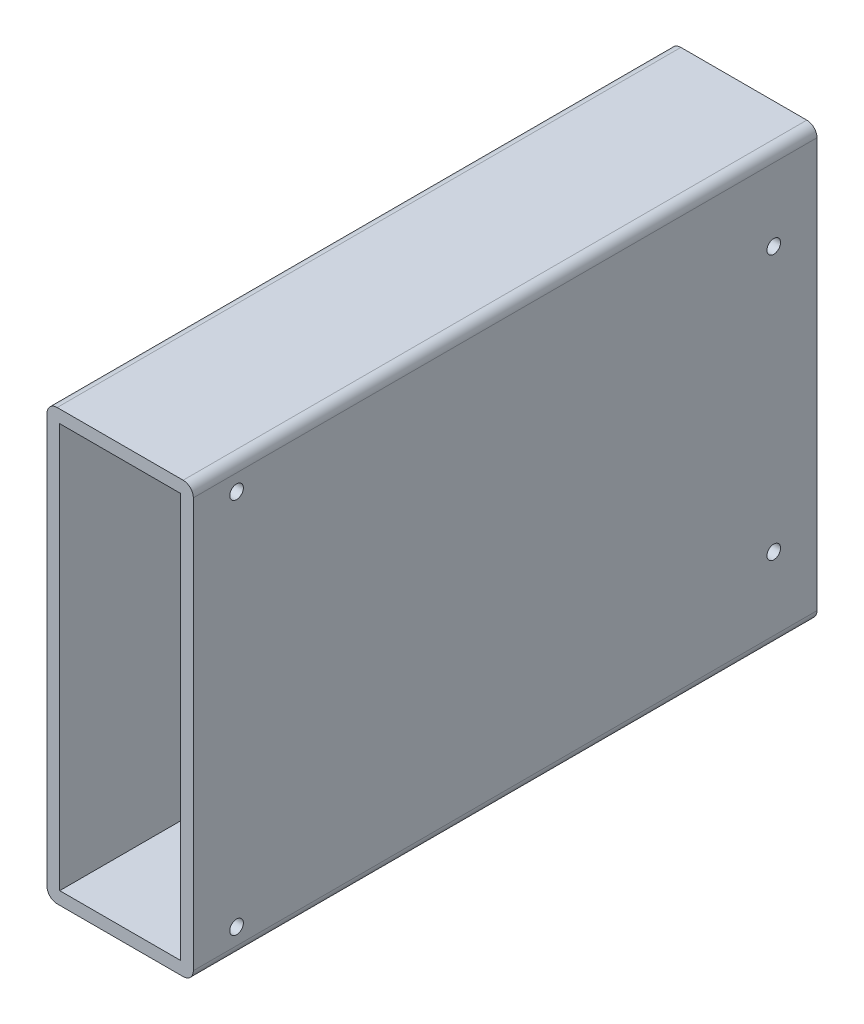
ISO-10303-21;
HEADER;
FILE_DESCRIPTION(('STEP AP214'),'2;1');
FILE_NAME('part.step','',(''),(''),'','','');
FILE_SCHEMA(('AUTOMOTIVE_DESIGN { 1 0 10303 214 1 1 1 1 }'));
ENDSEC;
DATA;
#1=APPLICATION_CONTEXT('core data for automotive mechanical design processes');
#2=APPLICATION_PROTOCOL_DEFINITION('international standard','automotive_design',2000,#1);
#3=PRODUCT_CONTEXT('',#1,'mechanical');
#4=PRODUCT('Part','Part','',(#3));
#5=PRODUCT_RELATED_PRODUCT_CATEGORY('part','',(#4));
#6=PRODUCT_DEFINITION_FORMATION('','',#4);
#7=PRODUCT_DEFINITION_CONTEXT('part definition',#1,'design');
#8=PRODUCT_DEFINITION('design','',#6,#7);
#9=PRODUCT_DEFINITION_SHAPE('','',#8);
#10=(LENGTH_UNIT() NAMED_UNIT(*) SI_UNIT(.MILLI.,.METRE.));
#11=(NAMED_UNIT(*) PLANE_ANGLE_UNIT() SI_UNIT($,.RADIAN.));
#12=(NAMED_UNIT(*) SI_UNIT($,.STERADIAN.) SOLID_ANGLE_UNIT());
#13=UNCERTAINTY_MEASURE_WITH_UNIT(LENGTH_MEASURE(1.E-05),#10,'distance_accuracy_value','');
#14=(GEOMETRIC_REPRESENTATION_CONTEXT(3) GLOBAL_UNCERTAINTY_ASSIGNED_CONTEXT((#13)) GLOBAL_UNIT_ASSIGNED_CONTEXT((#10,
#11,#12)) REPRESENTATION_CONTEXT('',''));
#15=CARTESIAN_POINT('',(0.,0.,0.));
#16=DIRECTION('',(0.,0.,1.));
#17=DIRECTION('',(1.,0.,0.));
#18=AXIS2_PLACEMENT_3D('',#15,#16,#17);
#19=CARTESIAN_POINT('',(36.5,0.,0.));
#20=DIRECTION('',(-1.,0.,0.));
#21=DIRECTION('',(0.,0.,1.));
#22=AXIS2_PLACEMENT_3D('',#19,#20,#21);
#23=PLANE('',#22);
#24=CARTESIAN_POINT('',(36.5,6.61875001399973,-10.7875000000006));
#25=DIRECTION('',(1.,0.,0.));
#26=DIRECTION('',(0.,0.,-1.));
#27=AXIS2_PLACEMENT_3D('',#24,#25,#26);
#28=CIRCLE('',#27,1.69999999999999);
#29=CARTESIAN_POINT('',(36.5,6.61875001399973,-12.4875000000006));
#30=VERTEX_POINT('',#29);
#31=EDGE_CURVE('E444',#30,#30,#28,.T.);
#32=ORIENTED_EDGE('',*,*,#31,.F.);
#33=EDGE_LOOP('',(#32));
#34=FACE_BOUND('',#33,.T.);
#35=CARTESIAN_POINT('',(36.5,100.618750014,-10.7875000000006));
#36=DIRECTION('',(1.,0.,0.));
#37=DIRECTION('',(0.,0.,-1.));
#38=AXIS2_PLACEMENT_3D('',#35,#36,#37);
#39=CIRCLE('',#38,1.69999999999999);
#40=CARTESIAN_POINT('',(36.5,100.618750014,-12.4875000000006));
#41=VERTEX_POINT('',#40);
#42=EDGE_CURVE('E450',#41,#41,#39,.T.);
#43=ORIENTED_EDGE('',*,*,#42,.F.);
#44=EDGE_LOOP('',(#43));
#45=FACE_BOUND('',#44,.T.);
#46=DIRECTION('',(0.,-1.,0.));
#47=VECTOR('',#46,1.);
#48=CARTESIAN_POINT('',(36.5,0.,0.));
#49=LINE('',#48,#47);
#50=CARTESIAN_POINT('',(36.5,104.697500028,0.));
#51=VERTEX_POINT('',#50);
#52=CARTESIAN_POINT('',(36.5,2.54,0.));
#53=VERTEX_POINT('',#52);
#54=EDGE_CURVE('E231',#51,#53,#49,.T.);
#55=ORIENTED_EDGE('',*,*,#54,.T.);
#56=DIRECTION('',(0.,0.,-1.));
#57=VECTOR('',#56,1.);
#58=CARTESIAN_POINT('',(36.5,2.54,0.));
#59=LINE('',#58,#57);
#60=CARTESIAN_POINT('',(36.5,2.54,-155.575));
#61=VERTEX_POINT('',#60);
#62=EDGE_CURVE('E257',#53,#61,#59,.T.);
#63=ORIENTED_EDGE('',*,*,#62,.T.);
#64=DIRECTION('',(0.,1.,0.));
#65=VECTOR('',#64,1.);
#66=CARTESIAN_POINT('',(36.5,0.,-155.575));
#67=LINE('',#66,#65);
#68=CARTESIAN_POINT('',(36.5,104.697500028,-155.575));
#69=VERTEX_POINT('',#68);
#70=EDGE_CURVE('E234',#61,#69,#67,.T.);
#71=ORIENTED_EDGE('',*,*,#70,.T.);
#72=DIRECTION('',(0.,0.,1.));
#73=VECTOR('',#72,1.);
#74=CARTESIAN_POINT('',(36.5,104.697500028,0.));
#75=LINE('',#74,#73);
#76=EDGE_CURVE('E254',#69,#51,#75,.T.);
#77=ORIENTED_EDGE('',*,*,#76,.T.);
#78=EDGE_LOOP('',(#55,#63,#71,#77));
#79=FACE_BOUND('',#78,.T.);
#80=CARTESIAN_POINT('',(36.5,20.6187500139995,-144.787500000001));
#81=DIRECTION('',(1.,0.,0.));
#82=DIRECTION('',(0.,0.,-1.));
#83=AXIS2_PLACEMENT_3D('',#80,#81,#82);
#84=CIRCLE('',#83,1.69999999999999);
#85=CARTESIAN_POINT('',(36.5,20.6187500139995,-146.487500000001));
#86=VERTEX_POINT('',#85);
#87=EDGE_CURVE('E435',#86,#86,#84,.T.);
#88=ORIENTED_EDGE('',*,*,#87,.F.);
#89=EDGE_LOOP('',(#88));
#90=FACE_BOUND('',#89,.T.);
#91=CARTESIAN_POINT('',(36.5,86.6187500139995,-144.787500000001));
#92=DIRECTION('',(1.,0.,0.));
#93=DIRECTION('',(0.,0.,-1.));
#94=AXIS2_PLACEMENT_3D('',#91,#92,#93);
#95=CIRCLE('',#94,1.69999999999999);
#96=CARTESIAN_POINT('',(36.5,86.6187500139995,-146.487500000001));
#97=VERTEX_POINT('',#96);
#98=EDGE_CURVE('E431',#97,#97,#95,.T.);
#99=ORIENTED_EDGE('',*,*,#98,.F.);
#100=EDGE_LOOP('',(#99));
#101=FACE_BOUND('',#100,.T.);
#102=ADVANCED_FACE('F39',(#34,#45,#79,#90,#101),#23,.F.);
#103=CARTESIAN_POINT('',(36.5,0.,0.));
#104=DIRECTION('',(0.,0.,-1.));
#105=DIRECTION('',(-1.,0.,0.));
#106=AXIS2_PLACEMENT_3D('',#103,#104,#105);
#107=PLANE('',#106);
#108=DIRECTION('',(-1.,0.,0.));
#109=VECTOR('',#108,1.);
#110=CARTESIAN_POINT('',(36.5,0.,0.));
#111=LINE('',#110,#109);
#112=CARTESIAN_POINT('',(33.96,0.,0.));
#113=VERTEX_POINT('',#112);
#114=CARTESIAN_POINT('',(2.54,0.,0.));
#115=VERTEX_POINT('',#114);
#116=EDGE_CURVE('E251',#113,#115,#111,.T.);
#117=ORIENTED_EDGE('',*,*,#116,.F.);
#118=CARTESIAN_POINT('',(33.96,2.54,0.));
#119=DIRECTION('',(0.,0.,-1.));
#120=DIRECTION('',(-1.,0.,0.));
#121=AXIS2_PLACEMENT_3D('',#118,#119,#120);
#122=CIRCLE('',#121,2.54);
#123=EDGE_CURVE('E279',#113,#53,#122,.F.);
#124=ORIENTED_EDGE('',*,*,#123,.T.);
#125=ORIENTED_EDGE('',*,*,#54,.F.);
#126=CARTESIAN_POINT('',(33.96,104.697500028,0.));
#127=DIRECTION('',(0.,0.,-1.));
#128=DIRECTION('',(-1.,0.,0.));
#129=AXIS2_PLACEMENT_3D('',#126,#127,#128);
#130=CIRCLE('',#129,2.54);
#131=CARTESIAN_POINT('',(33.96,107.237500028,0.));
#132=VERTEX_POINT('',#131);
#133=EDGE_CURVE('E273',#51,#132,#130,.F.);
#134=ORIENTED_EDGE('',*,*,#133,.T.);
#135=DIRECTION('',(-1.,0.,0.));
#136=VECTOR('',#135,1.);
#137=CARTESIAN_POINT('',(36.5,107.237500028,0.));
#138=LINE('',#137,#136);
#139=CARTESIAN_POINT('',(2.54,107.237500028,0.));
#140=VERTEX_POINT('',#139);
#141=EDGE_CURVE('E238',#132,#140,#138,.T.);
#142=ORIENTED_EDGE('',*,*,#141,.T.);
#143=CARTESIAN_POINT('',(2.54,104.697500028,0.));
#144=DIRECTION('',(0.,0.,-1.));
#145=DIRECTION('',(-1.,0.,0.));
#146=AXIS2_PLACEMENT_3D('',#143,#144,#145);
#147=CIRCLE('',#146,2.54);
#148=CARTESIAN_POINT('',(0.,104.697500028,0.));
#149=VERTEX_POINT('',#148);
#150=EDGE_CURVE('E275',#140,#149,#147,.F.);
#151=ORIENTED_EDGE('',*,*,#150,.T.);
#152=DIRECTION('',(0.,-1.,0.));
#153=VECTOR('',#152,1.);
#154=CARTESIAN_POINT('',(0.,0.,0.));
#155=LINE('',#154,#153);
#156=CARTESIAN_POINT('',(0.,2.54,0.));
#157=VERTEX_POINT('',#156);
#158=EDGE_CURVE('E224',#149,#157,#155,.T.);
#159=ORIENTED_EDGE('',*,*,#158,.T.);
#160=CARTESIAN_POINT('',(2.54,2.54,0.));
#161=DIRECTION('',(0.,0.,-1.));
#162=DIRECTION('',(-1.,0.,0.));
#163=AXIS2_PLACEMENT_3D('',#160,#161,#162);
#164=CIRCLE('',#163,2.54);
#165=EDGE_CURVE('E277',#157,#115,#164,.F.);
#166=ORIENTED_EDGE('',*,*,#165,.T.);
#167=EDGE_LOOP('',(#117,#124,#125,#134,#142,#151,#159,#166));
#168=FACE_BOUND('',#167,.T.);
#169=DIRECTION('',(0.,-1.,0.));
#170=VECTOR('',#169,1.);
#171=CARTESIAN_POINT('',(3.175,0.,0.));
#172=LINE('',#171,#170);
#173=CARTESIAN_POINT('',(3.175,104.062500028,0.));
#174=VERTEX_POINT('',#173);
#175=CARTESIAN_POINT('',(3.175,3.175,0.));
#176=VERTEX_POINT('',#175);
#177=EDGE_CURVE('E158',#174,#176,#172,.T.);
#178=ORIENTED_EDGE('',*,*,#177,.F.);
#179=DIRECTION('',(-1.,0.,0.));
#180=VECTOR('',#179,1.);
#181=CARTESIAN_POINT('',(36.5,104.062500028,0.));
#182=LINE('',#181,#180);
#183=CARTESIAN_POINT('',(33.325,104.062500028,0.));
#184=VERTEX_POINT('',#183);
#185=EDGE_CURVE('E216',#184,#174,#182,.T.);
#186=ORIENTED_EDGE('',*,*,#185,.F.);
#187=DIRECTION('',(0.,-1.,0.));
#188=VECTOR('',#187,1.);
#189=CARTESIAN_POINT('',(33.325,0.,0.));
#190=LINE('',#189,#188);
#191=CARTESIAN_POINT('',(33.325,3.175,0.));
#192=VERTEX_POINT('',#191);
#193=EDGE_CURVE('E211',#184,#192,#190,.T.);
#194=ORIENTED_EDGE('',*,*,#193,.T.);
#195=DIRECTION('',(-1.,0.,0.));
#196=VECTOR('',#195,1.);
#197=CARTESIAN_POINT('',(36.5,3.175,0.));
#198=LINE('',#197,#196);
#199=EDGE_CURVE('E206',#192,#176,#198,.T.);
#200=ORIENTED_EDGE('',*,*,#199,.T.);
#201=EDGE_LOOP('',(#178,#186,#194,#200));
#202=FACE_BOUND('',#201,.T.);
#203=ADVANCED_FACE('F303',(#168,#202),#107,.F.);
#204=CARTESIAN_POINT('',(36.5,0.,0.));
#205=DIRECTION('',(0.,1.,0.));
#206=DIRECTION('',(0.,0.,1.));
#207=AXIS2_PLACEMENT_3D('',#204,#205,#206);
#208=PLANE('',#207);
#209=DIRECTION('',(-1.,0.,0.));
#210=VECTOR('',#209,1.);
#211=CARTESIAN_POINT('',(36.5,0.,-155.575));
#212=LINE('',#211,#210);
#213=CARTESIAN_POINT('',(33.96,0.,-155.575));
#214=VERTEX_POINT('',#213);
#215=CARTESIAN_POINT('',(2.54,0.,-155.575));
#216=VERTEX_POINT('',#215);
#217=EDGE_CURVE('E248',#214,#216,#212,.T.);
#218=ORIENTED_EDGE('',*,*,#217,.F.);
#219=DIRECTION('',(0.,0.,-1.));
#220=VECTOR('',#219,1.);
#221=CARTESIAN_POINT('',(33.96,0.,0.));
#222=LINE('',#221,#220);
#223=EDGE_CURVE('E271',#214,#113,#222,.F.);
#224=ORIENTED_EDGE('',*,*,#223,.T.);
#225=ORIENTED_EDGE('',*,*,#116,.T.);
#226=DIRECTION('',(0.,0.,-1.));
#227=VECTOR('',#226,1.);
#228=CARTESIAN_POINT('',(2.54,0.,-155.575));
#229=LINE('',#228,#227);
#230=EDGE_CURVE('E268',#115,#216,#229,.T.);
#231=ORIENTED_EDGE('',*,*,#230,.T.);
#232=EDGE_LOOP('',(#218,#224,#225,#231));
#233=FACE_BOUND('',#232,.T.);
#234=ADVANCED_FACE('F311',(#233),#208,.F.);
#235=CARTESIAN_POINT('',(36.5,0.,-155.575));
#236=DIRECTION('',(0.,0.,1.));
#237=DIRECTION('',(1.,0.,0.));
#238=AXIS2_PLACEMENT_3D('',#235,#236,#237);
#239=PLANE('',#238);
#240=CARTESIAN_POINT('',(7.175,25.4,-155.575));
#241=DIRECTION('',(0.,0.,1.));
#242=DIRECTION('',(1.,0.,0.));
#243=AXIS2_PLACEMENT_3D('',#240,#241,#242);
#244=CIRCLE('',#243,2.38125);
#245=CARTESIAN_POINT('',(9.55625,25.4,-155.575));
#246=VERTEX_POINT('',#245);
#247=EDGE_CURVE('E199',#246,#246,#244,.T.);
#248=ORIENTED_EDGE('',*,*,#247,.T.);
#249=EDGE_LOOP('',(#248));
#250=FACE_BOUND('',#249,.T.);
#251=DIRECTION('',(1.,0.,0.));
#252=VECTOR('',#251,1.);
#253=CARTESIAN_POINT('',(13.175,35.,-155.575));
#254=LINE('',#253,#252);
#255=CARTESIAN_POINT('',(13.175,35.,-155.575));
#256=VERTEX_POINT('',#255);
#257=CARTESIAN_POINT('',(28.175,35.,-155.575));
#258=VERTEX_POINT('',#257);
#259=EDGE_CURVE('E171',#256,#258,#254,.T.);
#260=ORIENTED_EDGE('',*,*,#259,.F.);
#261=DIRECTION('',(0.,1.,0.));
#262=VECTOR('',#261,1.);
#263=CARTESIAN_POINT('',(13.175,35.,-155.575));
#264=LINE('',#263,#262);
#265=CARTESIAN_POINT('',(13.175,20.,-155.575));
#266=VERTEX_POINT('',#265);
#267=EDGE_CURVE('E54',#266,#256,#264,.T.);
#268=ORIENTED_EDGE('',*,*,#267,.F.);
#269=DIRECTION('',(-1.,0.,0.));
#270=VECTOR('',#269,1.);
#271=CARTESIAN_POINT('',(13.175,20.,-155.575));
#272=LINE('',#271,#270);
#273=CARTESIAN_POINT('',(28.175,20.,-155.575));
#274=VERTEX_POINT('',#273);
#275=EDGE_CURVE('E164',#274,#266,#272,.T.);
#276=ORIENTED_EDGE('',*,*,#275,.F.);
#277=DIRECTION('',(0.,-1.,0.));
#278=VECTOR('',#277,1.);
#279=CARTESIAN_POINT('',(28.175,35.,-155.575));
#280=LINE('',#279,#278);
#281=EDGE_CURVE('E178',#258,#274,#280,.T.);
#282=ORIENTED_EDGE('',*,*,#281,.F.);
#283=EDGE_LOOP('',(#260,#268,#276,#282));
#284=FACE_BOUND('',#283,.T.);
#285=CARTESIAN_POINT('',(7.175,30.,-155.575));
#286=DIRECTION('',(0.,0.,-1.));
#287=DIRECTION('',(-1.,0.,0.));
#288=AXIS2_PLACEMENT_3D('',#285,#286,#287);
#289=CIRCLE('',#288,1.19999999999999);
#290=CARTESIAN_POINT('',(5.97500000000001,30.,-155.575));
#291=VERTEX_POINT('',#290);
#292=EDGE_CURVE('E190',#291,#291,#289,.T.);
#293=ORIENTED_EDGE('',*,*,#292,.F.);
#294=EDGE_LOOP('',(#293));
#295=FACE_BOUND('',#294,.T.);
#296=CARTESIAN_POINT('',(7.175,4.99999999999999,-155.575));
#297=DIRECTION('',(0.,0.,-1.));
#298=DIRECTION('',(-1.,0.,0.));
#299=AXIS2_PLACEMENT_3D('',#296,#297,#298);
#300=CIRCLE('',#299,1.19999999999999);
#301=CARTESIAN_POINT('',(5.97500000000001,4.99999999999999,-155.575));
#302=VERTEX_POINT('',#301);
#303=EDGE_CURVE('E196',#302,#302,#300,.T.);
#304=ORIENTED_EDGE('',*,*,#303,.F.);
#305=EDGE_LOOP('',(#304));
#306=FACE_BOUND('',#305,.T.);
#307=ORIENTED_EDGE('',*,*,#70,.F.);
#308=CARTESIAN_POINT('',(33.96,2.54,-155.575));
#309=DIRECTION('',(0.,0.,1.));
#310=DIRECTION('',(1.,0.,0.));
#311=AXIS2_PLACEMENT_3D('',#308,#309,#310);
#312=CIRCLE('',#311,2.54);
#313=EDGE_CURVE('E266',#61,#214,#312,.F.);
#314=ORIENTED_EDGE('',*,*,#313,.T.);
#315=ORIENTED_EDGE('',*,*,#217,.T.);
#316=CARTESIAN_POINT('',(2.54,2.54,-155.575));
#317=DIRECTION('',(0.,0.,1.));
#318=DIRECTION('',(1.,0.,0.));
#319=AXIS2_PLACEMENT_3D('',#316,#317,#318);
#320=CIRCLE('',#319,2.54);
#321=CARTESIAN_POINT('',(0.,2.54,-155.575));
#322=VERTEX_POINT('',#321);
#323=EDGE_CURVE('E264',#216,#322,#320,.F.);
#324=ORIENTED_EDGE('',*,*,#323,.T.);
#325=DIRECTION('',(0.,1.,0.));
#326=VECTOR('',#325,1.);
#327=CARTESIAN_POINT('',(0.,0.,-155.575));
#328=LINE('',#327,#326);
#329=CARTESIAN_POINT('',(0.,104.697500028,-155.575));
#330=VERTEX_POINT('',#329);
#331=EDGE_CURVE('E235',#322,#330,#328,.T.);
#332=ORIENTED_EDGE('',*,*,#331,.T.);
#333=CARTESIAN_POINT('',(2.54,104.697500028,-155.575));
#334=DIRECTION('',(0.,0.,1.));
#335=DIRECTION('',(1.,0.,0.));
#336=AXIS2_PLACEMENT_3D('',#333,#334,#335);
#337=CIRCLE('',#336,2.54);
#338=CARTESIAN_POINT('',(2.54,107.237500028,-155.575));
#339=VERTEX_POINT('',#338);
#340=EDGE_CURVE('E262',#330,#339,#337,.F.);
#341=ORIENTED_EDGE('',*,*,#340,.T.);
#342=DIRECTION('',(-1.,0.,0.));
#343=VECTOR('',#342,1.);
#344=CARTESIAN_POINT('',(36.5,107.237500028,-155.575));
#345=LINE('',#344,#343);
#346=CARTESIAN_POINT('',(33.96,107.237500028,-155.575));
#347=VERTEX_POINT('',#346);
#348=EDGE_CURVE('E245',#347,#339,#345,.T.);
#349=ORIENTED_EDGE('',*,*,#348,.F.);
#350=CARTESIAN_POINT('',(33.96,104.697500028,-155.575));
#351=DIRECTION('',(0.,0.,1.));
#352=DIRECTION('',(1.,0.,0.));
#353=AXIS2_PLACEMENT_3D('',#350,#351,#352);
#354=CIRCLE('',#353,2.54);
#355=EDGE_CURVE('E260',#347,#69,#354,.F.);
#356=ORIENTED_EDGE('',*,*,#355,.T.);
#357=EDGE_LOOP('',(#307,#314,#315,#324,#332,#341,#349,#356));
#358=FACE_BOUND('',#357,.T.);
#359=ADVANCED_FACE('F294',(#250,#284,#295,#306,#358),#239,.F.);
#360=CARTESIAN_POINT('',(36.5,107.237500028,0.));
#361=DIRECTION('',(0.,-1.,0.));
#362=DIRECTION('',(0.,0.,-1.));
#363=AXIS2_PLACEMENT_3D('',#360,#361,#362);
#364=PLANE('',#363);
#365=ORIENTED_EDGE('',*,*,#348,.T.);
#366=DIRECTION('',(0.,0.,1.));
#367=VECTOR('',#366,1.);
#368=CARTESIAN_POINT('',(2.54,107.237500028,0.));
#369=LINE('',#368,#367);
#370=EDGE_CURVE('E11',#339,#140,#369,.T.);
#371=ORIENTED_EDGE('',*,*,#370,.T.);
#372=ORIENTED_EDGE('',*,*,#141,.F.);
#373=DIRECTION('',(0.,0.,1.));
#374=VECTOR('',#373,1.);
#375=CARTESIAN_POINT('',(33.96,107.237500028,0.));
#376=LINE('',#375,#374);
#377=EDGE_CURVE('E47',#132,#347,#376,.F.);
#378=ORIENTED_EDGE('',*,*,#377,.T.);
#379=EDGE_LOOP('',(#365,#371,#372,#378));
#380=FACE_BOUND('',#379,.T.);
#381=ADVANCED_FACE('F288',(#380),#364,.F.);
#382=CARTESIAN_POINT('',(0.,0.,0.));
#383=DIRECTION('',(-1.,0.,0.));
#384=DIRECTION('',(0.,0.,1.));
#385=AXIS2_PLACEMENT_3D('',#382,#383,#384);
#386=PLANE('',#385);
#387=ORIENTED_EDGE('',*,*,#331,.F.);
#388=DIRECTION('',(0.,0.,-1.));
#389=VECTOR('',#388,1.);
#390=CARTESIAN_POINT('',(0.,2.54,0.));
#391=LINE('',#390,#389);
#392=EDGE_CURVE('E283',#322,#157,#391,.F.);
#393=ORIENTED_EDGE('',*,*,#392,.T.);
#394=ORIENTED_EDGE('',*,*,#158,.F.);
#395=DIRECTION('',(0.,0.,1.));
#396=VECTOR('',#395,1.);
#397=CARTESIAN_POINT('',(0.,104.697500028,-155.575));
#398=LINE('',#397,#396);
#399=EDGE_CURVE('E281',#149,#330,#398,.F.);
#400=ORIENTED_EDGE('',*,*,#399,.T.);
#401=EDGE_LOOP('',(#387,#393,#394,#400));
#402=FACE_BOUND('',#401,.T.);
#403=ADVANCED_FACE('F319',(#402),#386,.T.);
#404=CARTESIAN_POINT('',(36.5,3.175,0.));
#405=DIRECTION('',(0.,1.,0.));
#406=DIRECTION('',(0.,0.,1.));
#407=AXIS2_PLACEMENT_3D('',#404,#405,#406);
#408=PLANE('',#407);
#409=DIRECTION('',(0.,0.,-1.));
#410=VECTOR('',#409,1.);
#411=CARTESIAN_POINT('',(3.175,3.175,0.));
#412=LINE('',#411,#410);
#413=CARTESIAN_POINT('',(3.175,3.175,-152.4));
#414=VERTEX_POINT('',#413);
#415=EDGE_CURVE('E200',#176,#414,#412,.T.);
#416=ORIENTED_EDGE('',*,*,#415,.F.);
#417=ORIENTED_EDGE('',*,*,#199,.F.);
#418=DIRECTION('',(0.,0.,-1.));
#419=VECTOR('',#418,1.);
#420=CARTESIAN_POINT('',(33.325,3.175,0.));
#421=LINE('',#420,#419);
#422=CARTESIAN_POINT('',(33.325,3.175,-152.4));
#423=VERTEX_POINT('',#422);
#424=EDGE_CURVE('E208',#192,#423,#421,.T.);
#425=ORIENTED_EDGE('',*,*,#424,.T.);
#426=DIRECTION('',(-1.,0.,0.));
#427=VECTOR('',#426,1.);
#428=CARTESIAN_POINT('',(36.5,3.175,-152.4));
#429=LINE('',#428,#427);
#430=EDGE_CURVE('E203',#423,#414,#429,.T.);
#431=ORIENTED_EDGE('',*,*,#430,.T.);
#432=EDGE_LOOP('',(#416,#417,#425,#431));
#433=FACE_BOUND('',#432,.T.);
#434=ADVANCED_FACE('F348',(#433),#408,.T.);
#435=CARTESIAN_POINT('',(36.5,0.,-152.4));
#436=DIRECTION('',(0.,0.,1.));
#437=DIRECTION('',(1.,0.,0.));
#438=AXIS2_PLACEMENT_3D('',#435,#436,#437);
#439=PLANE('',#438);
#440=CARTESIAN_POINT('',(7.175,25.4,-152.4));
#441=DIRECTION('',(0.,0.,1.));
#442=DIRECTION('',(1.,0.,0.));
#443=AXIS2_PLACEMENT_3D('',#440,#441,#442);
#444=CIRCLE('',#443,2.38125);
#445=CARTESIAN_POINT('',(9.55625,25.4,-152.4));
#446=VERTEX_POINT('',#445);
#447=EDGE_CURVE('E456',#446,#446,#444,.T.);
#448=ORIENTED_EDGE('',*,*,#447,.F.);
#449=EDGE_LOOP('',(#448));
#450=FACE_BOUND('',#449,.T.);
#451=DIRECTION('',(0.,1.,0.));
#452=VECTOR('',#451,1.);
#453=CARTESIAN_POINT('',(13.175,35.,-152.4));
#454=LINE('',#453,#452);
#455=CARTESIAN_POINT('',(13.175,20.,-152.4));
#456=VERTEX_POINT('',#455);
#457=CARTESIAN_POINT('',(13.175,35.,-152.4));
#458=VERTEX_POINT('',#457);
#459=EDGE_CURVE('E162',#456,#458,#454,.T.);
#460=ORIENTED_EDGE('',*,*,#459,.T.);
#461=DIRECTION('',(1.,0.,0.));
#462=VECTOR('',#461,1.);
#463=CARTESIAN_POINT('',(13.175,35.,-152.4));
#464=LINE('',#463,#462);
#465=CARTESIAN_POINT('',(28.175,35.,-152.4));
#466=VERTEX_POINT('',#465);
#467=EDGE_CURVE('E151',#458,#466,#464,.T.);
#468=ORIENTED_EDGE('',*,*,#467,.T.);
#469=DIRECTION('',(0.,-1.,0.));
#470=VECTOR('',#469,1.);
#471=CARTESIAN_POINT('',(28.175,35.,-152.4));
#472=LINE('',#471,#470);
#473=CARTESIAN_POINT('',(28.175,20.,-152.4));
#474=VERTEX_POINT('',#473);
#475=EDGE_CURVE('E173',#466,#474,#472,.T.);
#476=ORIENTED_EDGE('',*,*,#475,.T.);
#477=DIRECTION('',(-1.,0.,0.));
#478=VECTOR('',#477,1.);
#479=CARTESIAN_POINT('',(13.175,20.,-152.4));
#480=LINE('',#479,#478);
#481=EDGE_CURVE('E169',#474,#456,#480,.T.);
#482=ORIENTED_EDGE('',*,*,#481,.T.);
#483=EDGE_LOOP('',(#460,#468,#476,#482));
#484=FACE_BOUND('',#483,.T.);
#485=CARTESIAN_POINT('',(7.175,30.,-152.4));
#486=DIRECTION('',(0.,0.,1.));
#487=DIRECTION('',(1.,0.,0.));
#488=AXIS2_PLACEMENT_3D('',#485,#486,#487);
#489=CIRCLE('',#488,1.19999999999999);
#490=CARTESIAN_POINT('',(8.37499999999999,30.,-152.4));
#491=VERTEX_POINT('',#490);
#492=EDGE_CURVE('E187',#491,#491,#489,.F.);
#493=ORIENTED_EDGE('',*,*,#492,.T.);
#494=EDGE_LOOP('',(#493));
#495=FACE_BOUND('',#494,.T.);
#496=CARTESIAN_POINT('',(7.175,4.99999999999999,-152.4));
#497=DIRECTION('',(0.,0.,1.));
#498=DIRECTION('',(1.,0.,0.));
#499=AXIS2_PLACEMENT_3D('',#496,#497,#498);
#500=CIRCLE('',#499,1.19999999999999);
#501=CARTESIAN_POINT('',(8.37499999999998,4.99999999999999,-152.4));
#502=VERTEX_POINT('',#501);
#503=EDGE_CURVE('E193',#502,#502,#500,.F.);
#504=ORIENTED_EDGE('',*,*,#503,.T.);
#505=EDGE_LOOP('',(#504));
#506=FACE_BOUND('',#505,.T.);
#507=DIRECTION('',(0.,1.,0.));
#508=VECTOR('',#507,1.);
#509=CARTESIAN_POINT('',(3.175,0.,-152.4));
#510=LINE('',#509,#508);
#511=CARTESIAN_POINT('',(3.175,104.062500028,-152.4));
#512=VERTEX_POINT('',#511);
#513=EDGE_CURVE('E202',#414,#512,#510,.T.);
#514=ORIENTED_EDGE('',*,*,#513,.F.);
#515=ORIENTED_EDGE('',*,*,#430,.F.);
#516=DIRECTION('',(0.,1.,0.));
#517=VECTOR('',#516,1.);
#518=CARTESIAN_POINT('',(33.325,0.,-152.4));
#519=LINE('',#518,#517);
#520=CARTESIAN_POINT('',(33.325,104.062500028,-152.4));
#521=VERTEX_POINT('',#520);
#522=EDGE_CURVE('E210',#423,#521,#519,.T.);
#523=ORIENTED_EDGE('',*,*,#522,.T.);
#524=DIRECTION('',(-1.,0.,0.));
#525=VECTOR('',#524,1.);
#526=CARTESIAN_POINT('',(36.5,104.062500028,-152.4));
#527=LINE('',#526,#525);
#528=EDGE_CURVE('E207',#521,#512,#527,.T.);
#529=ORIENTED_EDGE('',*,*,#528,.T.);
#530=EDGE_LOOP('',(#514,#515,#523,#529));
#531=FACE_BOUND('',#530,.T.);
#532=ADVANCED_FACE('F167',(#450,#484,#495,#506,#531),#439,.T.);
#533=CARTESIAN_POINT('',(36.5,104.062500028,0.));
#534=DIRECTION('',(0.,-1.,0.));
#535=DIRECTION('',(0.,0.,-1.));
#536=AXIS2_PLACEMENT_3D('',#533,#534,#535);
#537=PLANE('',#536);
#538=DIRECTION('',(0.,0.,1.));
#539=VECTOR('',#538,1.);
#540=CARTESIAN_POINT('',(3.175,104.062500028,0.));
#541=LINE('',#540,#539);
#542=EDGE_CURVE('E213',#512,#174,#541,.T.);
#543=ORIENTED_EDGE('',*,*,#542,.F.);
#544=ORIENTED_EDGE('',*,*,#528,.F.);
#545=DIRECTION('',(0.,0.,1.));
#546=VECTOR('',#545,1.);
#547=CARTESIAN_POINT('',(33.325,104.062500028,0.));
#548=LINE('',#547,#546);
#549=EDGE_CURVE('E218',#521,#184,#548,.T.);
#550=ORIENTED_EDGE('',*,*,#549,.T.);
#551=ORIENTED_EDGE('',*,*,#185,.T.);
#552=EDGE_LOOP('',(#543,#544,#550,#551));
#553=FACE_BOUND('',#552,.T.);
#554=ADVANCED_FACE('F365',(#553),#537,.T.);
#555=CARTESIAN_POINT('',(33.325,0.,0.));
#556=DIRECTION('',(-1.,0.,0.));
#557=DIRECTION('',(0.,0.,1.));
#558=AXIS2_PLACEMENT_3D('',#555,#556,#557);
#559=PLANE('',#558);
#560=CARTESIAN_POINT('',(33.325,86.6187500139995,-144.787500000001));
#561=DIRECTION('',(-1.,0.,0.));
#562=DIRECTION('',(0.,0.,1.));
#563=AXIS2_PLACEMENT_3D('',#560,#561,#562);
#564=CIRCLE('',#563,1.69999999999999);
#565=CARTESIAN_POINT('',(33.325,86.6187500139995,-143.087500000001));
#566=VERTEX_POINT('',#565);
#567=EDGE_CURVE('E434',#566,#566,#564,.T.);
#568=ORIENTED_EDGE('',*,*,#567,.F.);
#569=EDGE_LOOP('',(#568));
#570=FACE_BOUND('',#569,.T.);
#571=CARTESIAN_POINT('',(33.325,20.6187500139995,-144.787500000001));
#572=DIRECTION('',(-1.,0.,0.));
#573=DIRECTION('',(0.,0.,1.));
#574=AXIS2_PLACEMENT_3D('',#571,#572,#573);
#575=CIRCLE('',#574,1.69999999999999);
#576=CARTESIAN_POINT('',(33.325,20.6187500139995,-143.087500000001));
#577=VERTEX_POINT('',#576);
#578=EDGE_CURVE('E438',#577,#577,#575,.T.);
#579=ORIENTED_EDGE('',*,*,#578,.F.);
#580=EDGE_LOOP('',(#579));
#581=FACE_BOUND('',#580,.T.);
#582=CARTESIAN_POINT('',(33.325,6.61875001399973,-10.7875000000006));
#583=DIRECTION('',(-1.,0.,0.));
#584=DIRECTION('',(0.,0.,1.));
#585=AXIS2_PLACEMENT_3D('',#582,#583,#584);
#586=CIRCLE('',#585,1.69999999999999);
#587=CARTESIAN_POINT('',(33.325,6.61875001399973,-9.08750000000065));
#588=VERTEX_POINT('',#587);
#589=EDGE_CURVE('E447',#588,#588,#586,.T.);
#590=ORIENTED_EDGE('',*,*,#589,.F.);
#591=EDGE_LOOP('',(#590));
#592=FACE_BOUND('',#591,.T.);
#593=CARTESIAN_POINT('',(33.325,100.618750014,-10.7875000000006));
#594=DIRECTION('',(-1.,0.,0.));
#595=DIRECTION('',(0.,0.,1.));
#596=AXIS2_PLACEMENT_3D('',#593,#594,#595);
#597=CIRCLE('',#596,1.69999999999999);
#598=CARTESIAN_POINT('',(33.325,100.618750014,-9.08750000000065));
#599=VERTEX_POINT('',#598);
#600=EDGE_CURVE('E453',#599,#599,#597,.T.);
#601=ORIENTED_EDGE('',*,*,#600,.F.);
#602=EDGE_LOOP('',(#601));
#603=FACE_BOUND('',#602,.T.);
#604=ORIENTED_EDGE('',*,*,#193,.F.);
#605=ORIENTED_EDGE('',*,*,#549,.F.);
#606=ORIENTED_EDGE('',*,*,#522,.F.);
#607=ORIENTED_EDGE('',*,*,#424,.F.);
#608=EDGE_LOOP('',(#604,#605,#606,#607));
#609=FACE_BOUND('',#608,.T.);
#610=ADVANCED_FACE('F360',(#570,#581,#592,#603,#609),#559,.T.);
#611=CARTESIAN_POINT('',(3.175,0.,0.));
#612=DIRECTION('',(-1.,0.,0.));
#613=DIRECTION('',(0.,0.,1.));
#614=AXIS2_PLACEMENT_3D('',#611,#612,#613);
#615=PLANE('',#614);
#616=ORIENTED_EDGE('',*,*,#177,.T.);
#617=ORIENTED_EDGE('',*,*,#415,.T.);
#618=ORIENTED_EDGE('',*,*,#513,.T.);
#619=ORIENTED_EDGE('',*,*,#542,.T.);
#620=EDGE_LOOP('',(#616,#617,#618,#619));
#621=FACE_BOUND('',#620,.T.);
#622=ADVANCED_FACE('F344',(#621),#615,.F.);
#623=CARTESIAN_POINT('',(33.96,2.54,0.));
#624=DIRECTION('',(0.,0.,-1.));
#625=DIRECTION('',(-1.,0.,0.));
#626=AXIS2_PLACEMENT_3D('',#623,#624,#625);
#627=CYLINDRICAL_SURFACE('',#626,2.54);
#628=ORIENTED_EDGE('',*,*,#123,.F.);
#629=ORIENTED_EDGE('',*,*,#223,.F.);
#630=ORIENTED_EDGE('',*,*,#313,.F.);
#631=ORIENTED_EDGE('',*,*,#62,.F.);
#632=EDGE_LOOP('',(#628,#629,#630,#631));
#633=FACE_BOUND('',#632,.T.);
#634=ADVANCED_FACE('F308',(#633),#627,.T.);
#635=CARTESIAN_POINT('',(2.54,2.54,0.));
#636=DIRECTION('',(0.,0.,1.));
#637=DIRECTION('',(1.,0.,0.));
#638=AXIS2_PLACEMENT_3D('',#635,#636,#637);
#639=CYLINDRICAL_SURFACE('',#638,2.54);
#640=ORIENTED_EDGE('',*,*,#165,.F.);
#641=ORIENTED_EDGE('',*,*,#392,.F.);
#642=ORIENTED_EDGE('',*,*,#323,.F.);
#643=ORIENTED_EDGE('',*,*,#230,.F.);
#644=EDGE_LOOP('',(#640,#641,#642,#643));
#645=FACE_BOUND('',#644,.T.);
#646=ADVANCED_FACE('F315',(#645),#639,.T.);
#647=CARTESIAN_POINT('',(2.54,104.697500028,0.));
#648=DIRECTION('',(0.,0.,-1.));
#649=DIRECTION('',(-1.,0.,0.));
#650=AXIS2_PLACEMENT_3D('',#647,#648,#649);
#651=CYLINDRICAL_SURFACE('',#650,2.54);
#652=ORIENTED_EDGE('',*,*,#340,.F.);
#653=ORIENTED_EDGE('',*,*,#399,.F.);
#654=ORIENTED_EDGE('',*,*,#150,.F.);
#655=ORIENTED_EDGE('',*,*,#370,.F.);
#656=EDGE_LOOP('',(#652,#653,#654,#655));
#657=FACE_BOUND('',#656,.T.);
#658=ADVANCED_FACE('F323',(#657),#651,.T.);
#659=CARTESIAN_POINT('',(33.96,104.697500028,0.));
#660=DIRECTION('',(0.,0.,1.));
#661=DIRECTION('',(1.,0.,0.));
#662=AXIS2_PLACEMENT_3D('',#659,#660,#661);
#663=CYLINDRICAL_SURFACE('',#662,2.54);
#664=ORIENTED_EDGE('',*,*,#355,.F.);
#665=ORIENTED_EDGE('',*,*,#377,.F.);
#666=ORIENTED_EDGE('',*,*,#133,.F.);
#667=ORIENTED_EDGE('',*,*,#76,.F.);
#668=EDGE_LOOP('',(#664,#665,#666,#667));
#669=FACE_BOUND('',#668,.T.);
#670=ADVANCED_FACE('F41',(#669),#663,.T.);
#671=CARTESIAN_POINT('',(7.175,4.99999999999999,0.001000000000001));
#672=DIRECTION('',(0.,0.,-1.));
#673=DIRECTION('',(-1.,0.,0.));
#674=AXIS2_PLACEMENT_3D('',#671,#672,#673);
#675=CYLINDRICAL_SURFACE('',#674,1.19999999999999);
#676=ORIENTED_EDGE('',*,*,#503,.F.);
#677=EDGE_LOOP('',(#676));
#678=FACE_BOUND('',#677,.T.);
#679=ORIENTED_EDGE('',*,*,#303,.T.);
#680=EDGE_LOOP('',(#679));
#681=FACE_BOUND('',#680,.T.);
#682=ADVANCED_FACE('F329',(#678,#681),#675,.F.);
#683=CARTESIAN_POINT('',(7.175,30.,0.001000000000001));
#684=DIRECTION('',(0.,0.,-1.));
#685=DIRECTION('',(-1.,0.,0.));
#686=AXIS2_PLACEMENT_3D('',#683,#684,#685);
#687=CYLINDRICAL_SURFACE('',#686,1.19999999999999);
#688=ORIENTED_EDGE('',*,*,#492,.F.);
#689=EDGE_LOOP('',(#688));
#690=FACE_BOUND('',#689,.T.);
#691=ORIENTED_EDGE('',*,*,#292,.T.);
#692=EDGE_LOOP('',(#691));
#693=FACE_BOUND('',#692,.T.);
#694=ADVANCED_FACE('F391',(#690,#693),#687,.F.);
#695=CARTESIAN_POINT('',(13.175,35.,0.001000000000001));
#696=DIRECTION('',(-1.,0.,0.));
#697=DIRECTION('',(0.,-1.,0.));
#698=AXIS2_PLACEMENT_3D('',#695,#696,#697);
#699=PLANE('',#698);
#700=DIRECTION('',(0.,0.,-1.));
#701=VECTOR('',#700,1.);
#702=CARTESIAN_POINT('',(13.175,20.,0.001000000000001));
#703=LINE('',#702,#701);
#704=EDGE_CURVE('E159',#456,#266,#703,.T.);
#705=ORIENTED_EDGE('',*,*,#704,.T.);
#706=ORIENTED_EDGE('',*,*,#267,.T.);
#707=DIRECTION('',(0.,0.,-1.));
#708=VECTOR('',#707,1.);
#709=CARTESIAN_POINT('',(13.175,35.,0.001000000000001));
#710=LINE('',#709,#708);
#711=EDGE_CURVE('E153',#458,#256,#710,.T.);
#712=ORIENTED_EDGE('',*,*,#711,.F.);
#713=ORIENTED_EDGE('',*,*,#459,.F.);
#714=EDGE_LOOP('',(#705,#706,#712,#713));
#715=FACE_BOUND('',#714,.T.);
#716=ADVANCED_FACE('F161',(#715),#699,.F.);
#717=CARTESIAN_POINT('',(13.175,20.,0.001000000000001));
#718=DIRECTION('',(0.,-1.,0.));
#719=DIRECTION('',(1.,0.,0.));
#720=AXIS2_PLACEMENT_3D('',#717,#718,#719);
#721=PLANE('',#720);
#722=DIRECTION('',(0.,0.,-1.));
#723=VECTOR('',#722,1.);
#724=CARTESIAN_POINT('',(28.175,20.,0.001000000000001));
#725=LINE('',#724,#723);
#726=EDGE_CURVE('E184',#474,#274,#725,.T.);
#727=ORIENTED_EDGE('',*,*,#726,.T.);
#728=ORIENTED_EDGE('',*,*,#275,.T.);
#729=ORIENTED_EDGE('',*,*,#704,.F.);
#730=ORIENTED_EDGE('',*,*,#481,.F.);
#731=EDGE_LOOP('',(#727,#728,#729,#730));
#732=FACE_BOUND('',#731,.T.);
#733=ADVANCED_FACE('F398',(#732),#721,.F.);
#734=CARTESIAN_POINT('',(28.175,35.,0.001000000000001));
#735=DIRECTION('',(1.,0.,0.));
#736=DIRECTION('',(0.,1.,0.));
#737=AXIS2_PLACEMENT_3D('',#734,#735,#736);
#738=PLANE('',#737);
#739=DIRECTION('',(0.,0.,-1.));
#740=VECTOR('',#739,1.);
#741=CARTESIAN_POINT('',(28.175,35.,0.001000000000001));
#742=LINE('',#741,#740);
#743=EDGE_CURVE('E62',#466,#258,#742,.T.);
#744=ORIENTED_EDGE('',*,*,#743,.T.);
#745=ORIENTED_EDGE('',*,*,#281,.T.);
#746=ORIENTED_EDGE('',*,*,#726,.F.);
#747=ORIENTED_EDGE('',*,*,#475,.F.);
#748=EDGE_LOOP('',(#744,#745,#746,#747));
#749=FACE_BOUND('',#748,.T.);
#750=ADVANCED_FACE('F402',(#749),#738,.F.);
#751=CARTESIAN_POINT('',(13.175,35.,0.001000000000001));
#752=DIRECTION('',(0.,1.,0.));
#753=DIRECTION('',(0.,0.,1.));
#754=AXIS2_PLACEMENT_3D('',#751,#752,#753);
#755=PLANE('',#754);
#756=ORIENTED_EDGE('',*,*,#711,.T.);
#757=ORIENTED_EDGE('',*,*,#259,.T.);
#758=ORIENTED_EDGE('',*,*,#743,.F.);
#759=ORIENTED_EDGE('',*,*,#467,.F.);
#760=EDGE_LOOP('',(#756,#757,#758,#759));
#761=FACE_BOUND('',#760,.T.);
#762=ADVANCED_FACE('F152',(#761),#755,.F.);
#763=CARTESIAN_POINT('',(7.175,25.4,-155.575));
#764=DIRECTION('',(0.,0.,1.));
#765=DIRECTION('',(1.,0.,0.));
#766=AXIS2_PLACEMENT_3D('',#763,#764,#765);
#767=CYLINDRICAL_SURFACE('',#766,2.38125);
#768=CARTESIAN_POINT('',(9.55625,25.4,-155.575));
#769=CARTESIAN_POINT('',(9.55625,25.4,-155.541927083333));
#770=CARTESIAN_POINT('',(9.55625,25.4,-155.508854166667));
#771=CARTESIAN_POINT('',(9.55625,25.4,-155.442708333333));
#772=CARTESIAN_POINT('',(9.55625,25.4,-155.409635416667));
#773=CARTESIAN_POINT('',(9.55625,25.4,-155.343489583333));
#774=CARTESIAN_POINT('',(9.55625,25.4,-155.310416666667));
#775=CARTESIAN_POINT('',(9.55625,25.4,-155.244270833333));
#776=CARTESIAN_POINT('',(9.55625,25.4,-155.211197916667));
#777=CARTESIAN_POINT('',(9.55625,25.4,-155.145052083333));
#778=CARTESIAN_POINT('',(9.55625,25.4,-155.111979166667));
#779=CARTESIAN_POINT('',(9.55625,25.4,-155.045833333333));
#780=CARTESIAN_POINT('',(9.55625,25.4,-155.012760416667));
#781=CARTESIAN_POINT('',(9.55625,25.4,-154.946614583333));
#782=CARTESIAN_POINT('',(9.55625,25.4,-154.913541666667));
#783=CARTESIAN_POINT('',(9.55625,25.4,-154.847395833333));
#784=CARTESIAN_POINT('',(9.55625,25.4,-154.814322916667));
#785=CARTESIAN_POINT('',(9.55625,25.4,-154.748177083333));
#786=CARTESIAN_POINT('',(9.55625,25.4,-154.715104166667));
#787=CARTESIAN_POINT('',(9.55625,25.4,-154.648958333333));
#788=CARTESIAN_POINT('',(9.55625,25.4,-154.615885416667));
#789=CARTESIAN_POINT('',(9.55625,25.4,-154.549739583333));
#790=CARTESIAN_POINT('',(9.55625,25.4,-154.516666666667));
#791=CARTESIAN_POINT('',(9.55625,25.4,-154.450520833333));
#792=CARTESIAN_POINT('',(9.55625,25.4,-154.417447916667));
#793=CARTESIAN_POINT('',(9.55625,25.4,-154.351302083333));
#794=CARTESIAN_POINT('',(9.55625,25.4,-154.318229166667));
#795=CARTESIAN_POINT('',(9.55625,25.4,-154.252083333333));
#796=CARTESIAN_POINT('',(9.55625,25.4,-154.219010416667));
#797=CARTESIAN_POINT('',(9.55625,25.4,-154.152864583333));
#798=CARTESIAN_POINT('',(9.55625,25.4,-154.119791666667));
#799=CARTESIAN_POINT('',(9.55625,25.4,-154.053645833333));
#800=CARTESIAN_POINT('',(9.55625,25.4,-154.020572916667));
#801=CARTESIAN_POINT('',(9.55625,25.4,-153.954427083333));
#802=CARTESIAN_POINT('',(9.55625,25.4,-153.921354166667));
#803=CARTESIAN_POINT('',(9.55625,25.4,-153.855208333333));
#804=CARTESIAN_POINT('',(9.55625,25.4,-153.822135416667));
#805=CARTESIAN_POINT('',(9.55625,25.4,-153.755989583333));
#806=CARTESIAN_POINT('',(9.55625,25.4,-153.722916666667));
#807=CARTESIAN_POINT('',(9.55625,25.4,-153.656770833333));
#808=CARTESIAN_POINT('',(9.55625,25.4,-153.623697916667));
#809=CARTESIAN_POINT('',(9.55625,25.4,-153.557552083333));
#810=CARTESIAN_POINT('',(9.55625,25.4,-153.524479166667));
#811=CARTESIAN_POINT('',(9.55625,25.4,-153.458333333333));
#812=CARTESIAN_POINT('',(9.55625,25.4,-153.425260416667));
#813=CARTESIAN_POINT('',(9.55625,25.4,-153.359114583333));
#814=CARTESIAN_POINT('',(9.55625,25.4,-153.326041666667));
#815=CARTESIAN_POINT('',(9.55625,25.4,-153.259895833333));
#816=CARTESIAN_POINT('',(9.55625,25.4,-153.226822916667));
#817=CARTESIAN_POINT('',(9.55625,25.4,-153.160677083333));
#818=CARTESIAN_POINT('',(9.55625,25.4,-153.127604166667));
#819=CARTESIAN_POINT('',(9.55625,25.4,-153.061458333333));
#820=CARTESIAN_POINT('',(9.55625,25.4,-153.028385416667));
#821=CARTESIAN_POINT('',(9.55625,25.4,-152.962239583333));
#822=CARTESIAN_POINT('',(9.55625,25.4,-152.929166666667));
#823=CARTESIAN_POINT('',(9.55625,25.4,-152.863020833333));
#824=CARTESIAN_POINT('',(9.55625,25.4,-152.829947916667));
#825=CARTESIAN_POINT('',(9.55625,25.4,-152.763802083333));
#826=CARTESIAN_POINT('',(9.55625,25.4,-152.730729166667));
#827=CARTESIAN_POINT('',(9.55625,25.4,-152.664583333333));
#828=CARTESIAN_POINT('',(9.55625,25.4,-152.631510416667));
#829=CARTESIAN_POINT('',(9.55625,25.4,-152.565364583333));
#830=CARTESIAN_POINT('',(9.55625,25.4,-152.532291666667));
#831=CARTESIAN_POINT('',(9.55625,25.4,-152.466145833333));
#832=CARTESIAN_POINT('',(9.55625,25.4,-152.433072916667));
#833=CARTESIAN_POINT('',(9.55625,25.4,-152.4));
#834=B_SPLINE_CURVE_WITH_KNOTS('',3,(#768,#769,#770,#771,#772,#773,#774,#775,#776,#777,#778,
#779,#780,#781,#782,#783,#784,#785,#786,#787,#788,#789,#790,#791,#792,#793,#794,#795,#796,#797,
#798,#799,#800,#801,#802,#803,#804,#805,#806,#807,#808,#809,#810,#811,#812,#813,#814,#815,#816,
#817,#818,#819,#820,#821,#822,#823,#824,#825,#826,#827,#828,#829,#830,#831,#832,#833),
.UNSPECIFIED.,.F.,.F.,(4,2,2,2,2,2,2,2,2,2,2,2,2,2,2,2,2,2,2,2,2,2,2,2,2,2,2,2,2,2,2,2,4),(0.,
0.0992187500000186,0.198437500000009,0.297656250000028,0.396875000000019,0.49609375000001,
0.595312500000028,0.694531250000019,0.79375000000001,0.892968750000028,0.992187500000019,
1.09140625000001,1.19062500000003,1.28984375000002,1.38906250000001,1.48828125000003,
1.58750000000002,1.68671875000001,1.78593750000003,1.88515625000002,1.98437500000001,
2.08359375000003,2.18281250000002,2.28203125000001,2.38125000000003,2.48046875000002,
2.57968750000001,2.67890625000003,2.77812500000002,2.87734375000001,2.97656250000003,
3.07578125000002,3.17500000000001),.UNSPECIFIED.);
#835=EDGE_CURVE('BSEAM401',#246,#446,#834,.T.);
#836=ORIENTED_EDGE('',*,*,#247,.F.);
#837=ORIENTED_EDGE('',*,*,#447,.T.);
#838=ORIENTED_EDGE('',*,*,#835,.T.);
#839=ORIENTED_EDGE('',*,*,#835,.F.);
#840=EDGE_LOOP('',(#836,#838,#837,#839));
#841=FACE_BOUND('',#840,.T.);
#842=ADVANCED_FACE('F401',(#841),#767,.F.);
#843=CARTESIAN_POINT('',(36.5,100.618750014,-10.7875000000006));
#844=DIRECTION('',(1.,0.,0.));
#845=DIRECTION('',(0.,0.,-1.));
#846=AXIS2_PLACEMENT_3D('',#843,#844,#845);
#847=CYLINDRICAL_SURFACE('',#846,1.69999999999999);
#848=ORIENTED_EDGE('',*,*,#42,.T.);
#849=EDGE_LOOP('',(#848));
#850=FACE_BOUND('',#849,.T.);
#851=ORIENTED_EDGE('',*,*,#600,.T.);
#852=EDGE_LOOP('',(#851));
#853=FACE_BOUND('',#852,.T.);
#854=ADVANCED_FACE('F410',(#850,#853),#847,.F.);
#855=CARTESIAN_POINT('',(36.5,6.61875001399973,-10.7875000000006));
#856=DIRECTION('',(1.,0.,0.));
#857=DIRECTION('',(0.,0.,-1.));
#858=AXIS2_PLACEMENT_3D('',#855,#856,#857);
#859=CYLINDRICAL_SURFACE('',#858,1.69999999999999);
#860=ORIENTED_EDGE('',*,*,#31,.T.);
#861=EDGE_LOOP('',(#860));
#862=FACE_BOUND('',#861,.T.);
#863=ORIENTED_EDGE('',*,*,#589,.T.);
#864=EDGE_LOOP('',(#863));
#865=FACE_BOUND('',#864,.T.);
#866=ADVANCED_FACE('F414',(#862,#865),#859,.F.);
#867=CARTESIAN_POINT('',(36.5,20.6187500139995,-144.787500000001));
#868=DIRECTION('',(1.,0.,0.));
#869=DIRECTION('',(0.,0.,-1.));
#870=AXIS2_PLACEMENT_3D('',#867,#868,#869);
#871=CYLINDRICAL_SURFACE('',#870,1.69999999999999);
#872=ORIENTED_EDGE('',*,*,#87,.T.);
#873=EDGE_LOOP('',(#872));
#874=FACE_BOUND('',#873,.T.);
#875=ORIENTED_EDGE('',*,*,#578,.T.);
#876=EDGE_LOOP('',(#875));
#877=FACE_BOUND('',#876,.T.);
#878=ADVANCED_FACE('F418',(#874,#877),#871,.F.);
#879=CARTESIAN_POINT('',(36.5,86.6187500139995,-144.787500000001));
#880=DIRECTION('',(1.,0.,0.));
#881=DIRECTION('',(0.,0.,-1.));
#882=AXIS2_PLACEMENT_3D('',#879,#880,#881);
#883=CYLINDRICAL_SURFACE('',#882,1.69999999999999);
#884=ORIENTED_EDGE('',*,*,#98,.T.);
#885=EDGE_LOOP('',(#884));
#886=FACE_BOUND('',#885,.T.);
#887=ORIENTED_EDGE('',*,*,#567,.T.);
#888=EDGE_LOOP('',(#887));
#889=FACE_BOUND('',#888,.T.);
#890=ADVANCED_FACE('F422',(#886,#889),#883,.F.);
#891=CLOSED_SHELL('',(#102,#203,#234,#359,#381,#403,#434,#532,#554,#610,#622,#634,#646,#658,
#670,#682,#694,#716,#733,#750,#762,#842,#854,#866,#878,#890));
#892=MANIFOLD_SOLID_BREP('B2',#891);
#893=ADVANCED_BREP_SHAPE_REPRESENTATION('',(#18,#892),#14);
#894=SHAPE_DEFINITION_REPRESENTATION(#9,#893);
ENDSEC;
END-ISO-10303-21;
